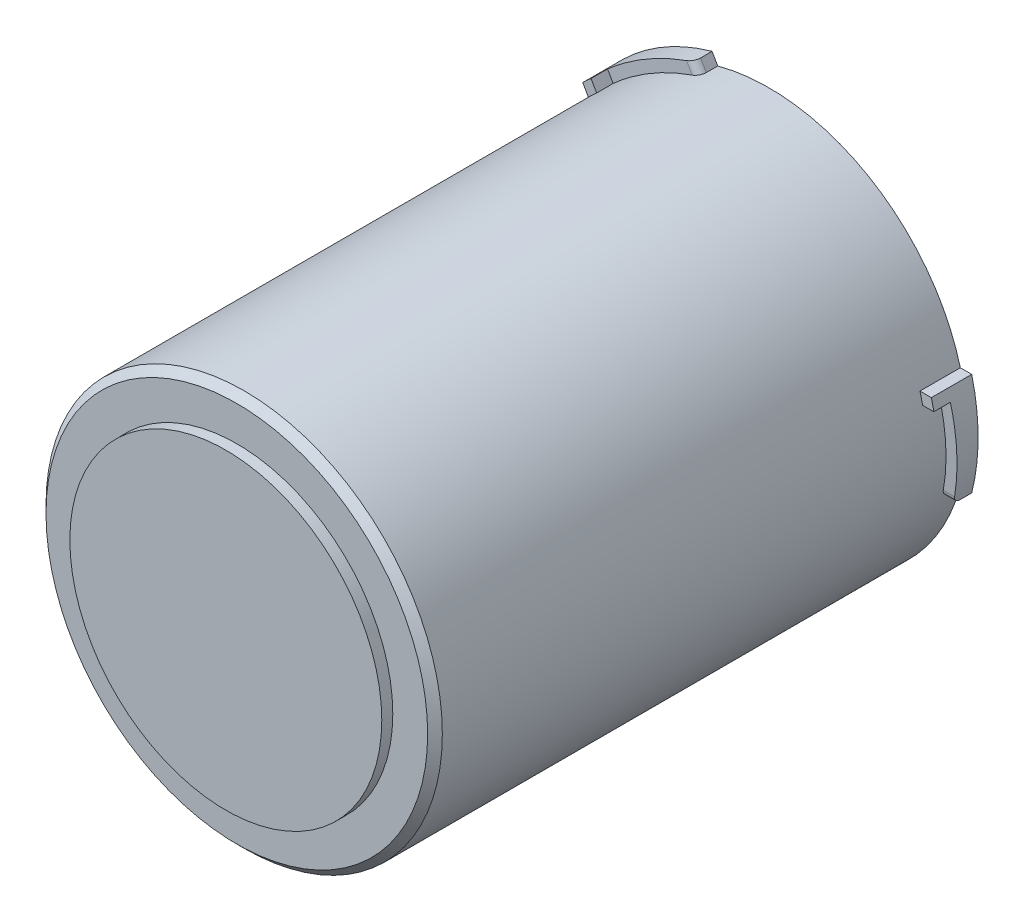
ISO-10303-21;
HEADER;
FILE_DESCRIPTION(('STEP AP214'),'2;1');
FILE_NAME('part.step','',(''),(''),'','','');
FILE_SCHEMA(('AUTOMOTIVE_DESIGN { 1 0 10303 214 1 1 1 1 }'));
ENDSEC;
DATA;
#1=APPLICATION_CONTEXT('core data for automotive mechanical design processes');
#2=APPLICATION_PROTOCOL_DEFINITION('international standard','automotive_design',2000,#1);
#3=PRODUCT_CONTEXT('',#1,'mechanical');
#4=PRODUCT('Part','Part','',(#3));
#5=PRODUCT_RELATED_PRODUCT_CATEGORY('part','',(#4));
#6=PRODUCT_DEFINITION_FORMATION('','',#4);
#7=PRODUCT_DEFINITION_CONTEXT('part definition',#1,'design');
#8=PRODUCT_DEFINITION('design','',#6,#7);
#9=PRODUCT_DEFINITION_SHAPE('','',#8);
#10=(LENGTH_UNIT() NAMED_UNIT(*) SI_UNIT(.MILLI.,.METRE.));
#11=(NAMED_UNIT(*) PLANE_ANGLE_UNIT() SI_UNIT($,.RADIAN.));
#12=(NAMED_UNIT(*) SI_UNIT($,.STERADIAN.) SOLID_ANGLE_UNIT());
#13=UNCERTAINTY_MEASURE_WITH_UNIT(LENGTH_MEASURE(1.E-05),#10,'distance_accuracy_value','');
#14=(GEOMETRIC_REPRESENTATION_CONTEXT(3) GLOBAL_UNCERTAINTY_ASSIGNED_CONTEXT((#13)) GLOBAL_UNIT_ASSIGNED_CONTEXT((#10,
#11,#12)) REPRESENTATION_CONTEXT('',''));
#15=CARTESIAN_POINT('',(0.,0.,0.));
#16=DIRECTION('',(0.,0.,1.));
#17=DIRECTION('',(1.,0.,0.));
#18=AXIS2_PLACEMENT_3D('',#15,#16,#17);
#19=CARTESIAN_POINT('',(-54.,0.,-145.));
#20=DIRECTION('',(0.,0.,-1.));
#21=DIRECTION('',(-1.,0.,0.));
#22=AXIS2_PLACEMENT_3D('',#19,#20,#21);
#23=PLANE('',#22);
#24=CARTESIAN_POINT('',(0.,0.,-145.));
#25=DIRECTION('',(0.,0.,-1.));
#26=DIRECTION('',(-1.,0.,0.));
#27=AXIS2_PLACEMENT_3D('',#24,#25,#26);
#28=CIRCLE('',#27,51.);
#29=CARTESIAN_POINT('',(-51.,0.,-145.));
#30=VERTEX_POINT('',#29);
#31=EDGE_CURVE('E296',#30,#30,#28,.T.);
#32=ORIENTED_EDGE('',*,*,#31,.F.);
#33=EDGE_LOOP('',(#32));
#34=FACE_BOUND('',#33,.T.);
#35=DIRECTION('',(-0.499999999999992,0.866025403784443,0.));
#36=VECTOR('',#35,1.);
#37=CARTESIAN_POINT('',(-35.6243556529818,33.7031939778689,-145.));
#38=LINE('',#37,#36);
#39=CARTESIAN_POINT('',(-38.2011652737924,38.1663591625452,-145.));
#40=VERTEX_POINT('',#39);
#41=CARTESIAN_POINT('',(-39.7513352200644,40.8513322698547,-145.));
#42=VERTEX_POINT('',#41);
#43=EDGE_CURVE('E201',#40,#42,#38,.T.);
#44=ORIENTED_EDGE('',*,*,#43,.T.);
#45=CARTESIAN_POINT('',(0.,0.,-145.));
#46=DIRECTION('',(0.,0.,-1.));
#47=DIRECTION('',(-1.,0.,0.));
#48=AXIS2_PLACEMENT_3D('',#45,#46,#47);
#49=CIRCLE('',#48,57.);
#50=CARTESIAN_POINT('',(-15.5026239141,54.8513322698545,-145.));
#51=VERTEX_POINT('',#50);
#52=EDGE_CURVE('E182',#42,#51,#49,.T.);
#53=ORIENTED_EDGE('',*,*,#52,.T.);
#54=DIRECTION('',(-0.499999999999992,0.866025403784443,0.));
#55=VECTOR('',#54,1.);
#56=CARTESIAN_POINT('',(-11.3756443470174,47.7031939778687,-145.));
#57=LINE('',#56,#55);
#58=CARTESIAN_POINT('',(-13.952453967828,52.166359162545,-145.));
#59=VERTEX_POINT('',#58);
#60=EDGE_CURVE('E212',#59,#51,#57,.T.);
#61=ORIENTED_EDGE('',*,*,#60,.F.);
#62=CARTESIAN_POINT('',(0.,0.,-145.));
#63=DIRECTION('',(0.,0.,-1.));
#64=DIRECTION('',(-1.,0.,0.));
#65=AXIS2_PLACEMENT_3D('',#62,#63,#64);
#66=CIRCLE('',#65,54.);
#67=CARTESIAN_POINT('',(52.1536192416212,14.,-145.));
#68=VERTEX_POINT('',#67);
#69=EDGE_CURVE('E299',#59,#68,#66,.T.);
#70=ORIENTED_EDGE('',*,*,#69,.T.);
#71=DIRECTION('',(1.,0.,0.));
#72=VECTOR('',#71,1.);
#73=CARTESIAN_POINT('',(47.,14.,-145.));
#74=LINE('',#73,#72);
#75=CARTESIAN_POINT('',(55.2539591341652,14.,-145.));
#76=VERTEX_POINT('',#75);
#77=EDGE_CURVE('E268',#68,#76,#74,.T.);
#78=ORIENTED_EDGE('',*,*,#77,.T.);
#79=CARTESIAN_POINT('',(55.2539591341652,-14.,-145.));
#80=VERTEX_POINT('',#79);
#81=EDGE_CURVE('E193',#76,#80,#49,.T.);
#82=ORIENTED_EDGE('',*,*,#81,.T.);
#83=DIRECTION('',(1.,0.,0.));
#84=VECTOR('',#83,1.);
#85=CARTESIAN_POINT('',(47.,-14.,-145.));
#86=LINE('',#85,#84);
#87=CARTESIAN_POINT('',(52.1536192416212,-14.,-145.));
#88=VERTEX_POINT('',#87);
#89=EDGE_CURVE('E272',#88,#80,#86,.T.);
#90=ORIENTED_EDGE('',*,*,#89,.F.);
#91=CARTESIAN_POINT('',(-13.9524539678287,-52.1663591625448,-145.));
#92=VERTEX_POINT('',#91);
#93=EDGE_CURVE('E300',#88,#92,#66,.T.);
#94=ORIENTED_EDGE('',*,*,#93,.T.);
#95=DIRECTION('',(-0.500000000000004,-0.866025403784436,0.));
#96=VECTOR('',#95,1.);
#97=CARTESIAN_POINT('',(-11.3756443470181,-47.7031939778686,-145.));
#98=LINE('',#97,#96);
#99=CARTESIAN_POINT('',(-15.5026239141007,-54.8513322698542,-145.));
#100=VERTEX_POINT('',#99);
#101=EDGE_CURVE('E239',#92,#100,#98,.T.);
#102=ORIENTED_EDGE('',*,*,#101,.T.);
#103=CARTESIAN_POINT('',(-39.7513352200649,-40.8513322698541,-145.));
#104=VERTEX_POINT('',#103);
#105=EDGE_CURVE('E195',#100,#104,#49,.T.);
#106=ORIENTED_EDGE('',*,*,#105,.T.);
#107=DIRECTION('',(-0.500000000000004,-0.866025403784436,0.));
#108=VECTOR('',#107,1.);
#109=CARTESIAN_POINT('',(-35.6243556529823,-33.7031939778685,-145.));
#110=LINE('',#109,#108);
#111=CARTESIAN_POINT('',(-38.2011652737929,-38.1663591625447,-145.));
#112=VERTEX_POINT('',#111);
#113=EDGE_CURVE('E243',#112,#104,#110,.T.);
#114=ORIENTED_EDGE('',*,*,#113,.F.);
#115=EDGE_CURVE('E210',#112,#40,#66,.T.);
#116=ORIENTED_EDGE('',*,*,#115,.T.);
#117=EDGE_LOOP('',(#44,#53,#61,#70,#78,#82,#90,#94,#102,#106,#114,#116));
#118=FACE_BOUND('',#117,.T.);
#119=ADVANCED_FACE('F39',(#34,#118),#23,.T.);
#120=CARTESIAN_POINT('',(47.,14.,-134.));
#121=DIRECTION('',(0.,1.,0.));
#122=DIRECTION('',(0.,0.,1.));
#123=AXIS2_PLACEMENT_3D('',#120,#121,#122);
#124=PLANE('',#123);
#125=DIRECTION('',(1.,0.,0.));
#126=VECTOR('',#125,1.);
#127=CARTESIAN_POINT('',(47.,14.,-134.));
#128=LINE('',#127,#126);
#129=CARTESIAN_POINT('',(52.1536192416212,14.,-134.));
#130=VERTEX_POINT('',#129);
#131=CARTESIAN_POINT('',(55.2539591341652,14.,-134.));
#132=VERTEX_POINT('',#131);
#133=EDGE_CURVE('E267',#130,#132,#128,.T.);
#134=ORIENTED_EDGE('',*,*,#133,.T.);
#135=DIRECTION('',(0.,0.,-1.));
#136=VECTOR('',#135,1.);
#137=CARTESIAN_POINT('',(55.2539591341652,14.,-130.));
#138=LINE('',#137,#136);
#139=EDGE_CURVE('E220',#132,#76,#138,.T.);
#140=ORIENTED_EDGE('',*,*,#139,.T.);
#141=ORIENTED_EDGE('',*,*,#77,.F.);
#142=DIRECTION('',(0.,0.,-1.));
#143=VECTOR('',#142,1.);
#144=CARTESIAN_POINT('',(52.1536192416212,14.,-2.99999999999999));
#145=LINE('',#144,#143);
#146=EDGE_CURVE('E293',#68,#130,#145,.F.);
#147=ORIENTED_EDGE('',*,*,#146,.T.);
#148=EDGE_LOOP('',(#134,#140,#141,#147));
#149=FACE_BOUND('',#148,.T.);
#150=ADVANCED_FACE('F414',(#149),#124,.T.);
#151=CARTESIAN_POINT('',(47.,-14.,-145.));
#152=DIRECTION('',(0.,-1.,0.));
#153=DIRECTION('',(0.,0.,-1.));
#154=AXIS2_PLACEMENT_3D('',#151,#152,#153);
#155=PLANE('',#154);
#156=ORIENTED_EDGE('',*,*,#89,.T.);
#157=DIRECTION('',(0.,0.,-1.));
#158=VECTOR('',#157,1.);
#159=CARTESIAN_POINT('',(55.2539591341652,-14.,-130.));
#160=LINE('',#159,#158);
#161=CARTESIAN_POINT('',(55.2539591341652,-14.,-141.883596765819));
#162=VERTEX_POINT('',#161);
#163=EDGE_CURVE('E392',#80,#162,#160,.F.);
#164=ORIENTED_EDGE('',*,*,#163,.T.);
#165=DIRECTION('',(1.,0.,0.));
#166=VECTOR('',#165,1.);
#167=CARTESIAN_POINT('',(47.,-14.,-141.883596765819));
#168=LINE('',#167,#166);
#169=CARTESIAN_POINT('',(52.1536192416212,-14.,-141.883596765819));
#170=VERTEX_POINT('',#169);
#171=EDGE_CURVE('E306',#162,#170,#168,.F.);
#172=ORIENTED_EDGE('',*,*,#171,.T.);
#173=DIRECTION('',(0.,0.,-1.));
#174=VECTOR('',#173,1.);
#175=CARTESIAN_POINT('',(52.1536192416212,-14.,-2.99999999999999));
#176=LINE('',#175,#174);
#177=EDGE_CURVE('E291',#170,#88,#176,.T.);
#178=ORIENTED_EDGE('',*,*,#177,.T.);
#179=EDGE_LOOP('',(#156,#164,#172,#178));
#180=FACE_BOUND('',#179,.T.);
#181=ADVANCED_FACE('F488',(#180),#155,.T.);
#182=CARTESIAN_POINT('',(47.,-14.,-140.));
#183=DIRECTION('',(0.,-0.0598922907279468,0.998204845465779));
#184=DIRECTION('',(0.,-0.998204845465779,-0.0598922907279468));
#185=AXIS2_PLACEMENT_3D('',#182,#183,#184);
#186=PLANE('',#185);
#187=DIRECTION('',(1.,0.,0.));
#188=VECTOR('',#187,1.);
#189=CARTESIAN_POINT('',(47.,-12.1197845814559,-139.887187074887));
#190=LINE('',#189,#188);
#191=CARTESIAN_POINT('',(52.6223414691812,-12.1197845814559,-139.887187074887));
#192=VERTEX_POINT('',#191);
#193=CARTESIAN_POINT('',(55.6965961410489,-12.1197845814559,-139.887187074887));
#194=VERTEX_POINT('',#193);
#195=EDGE_CURVE('E303',#192,#194,#190,.T.);
#196=ORIENTED_EDGE('',*,*,#195,.T.);
#197=CARTESIAN_POINT('',(0.,0.,-139.16));
#198=DIRECTION('',(0.,-0.0598922907279468,0.998204845465779));
#199=DIRECTION('',(0.,-0.998204845465779,-0.0598922907279468));
#200=AXIS2_PLACEMENT_3D('',#197,#198,#199);
#201=ELLIPSE('',#200,57.102507825839,57.);
#202=CARTESIAN_POINT('',(55.9285258164383,11.,-138.5));
#203=VERTEX_POINT('',#202);
#204=EDGE_CURVE('E55',#194,#203,#201,.T.);
#205=ORIENTED_EDGE('',*,*,#204,.T.);
#206=DIRECTION('',(1.,0.,0.));
#207=VECTOR('',#206,1.);
#208=CARTESIAN_POINT('',(47.,11.,-138.5));
#209=LINE('',#208,#207);
#210=CARTESIAN_POINT('',(52.8677595515452,10.9999999999999,-138.5));
#211=VERTEX_POINT('',#210);
#212=EDGE_CURVE('E275',#211,#203,#209,.T.);
#213=ORIENTED_EDGE('',*,*,#212,.F.);
#214=CARTESIAN_POINT('',(0.,0.,-139.16));
#215=DIRECTION('',(0.,-0.0598922907279468,0.998204845465779));
#216=DIRECTION('',(0.,-0.998204845465779,-0.0598922907279468));
#217=AXIS2_PLACEMENT_3D('',#214,#215,#216);
#218=ELLIPSE('',#217,54.0971126771106,54.);
#219=EDGE_CURVE('E288',#211,#192,#218,.F.);
#220=ORIENTED_EDGE('',*,*,#219,.T.);
#221=EDGE_LOOP('',(#196,#205,#213,#220));
#222=FACE_BOUND('',#221,.T.);
#223=ADVANCED_FACE('F506',(#222),#186,.T.);
#224=CARTESIAN_POINT('',(47.,11.,-138.5));
#225=DIRECTION('',(0.,-1.,0.));
#226=DIRECTION('',(0.,0.,-1.));
#227=AXIS2_PLACEMENT_3D('',#224,#225,#226);
#228=PLANE('',#227);
#229=ORIENTED_EDGE('',*,*,#212,.T.);
#230=DIRECTION('',(0.,0.,-1.));
#231=VECTOR('',#230,1.);
#232=CARTESIAN_POINT('',(55.9285258164383,11.,-130.));
#233=LINE('',#232,#231);
#234=CARTESIAN_POINT('',(55.9285258164383,11.,-134.));
#235=VERTEX_POINT('',#234);
#236=EDGE_CURVE('E396',#203,#235,#233,.F.);
#237=ORIENTED_EDGE('',*,*,#236,.T.);
#238=DIRECTION('',(1.,0.,0.));
#239=VECTOR('',#238,1.);
#240=CARTESIAN_POINT('',(47.,11.,-134.));
#241=LINE('',#240,#239);
#242=CARTESIAN_POINT('',(52.8677595515452,11.,-134.));
#243=VERTEX_POINT('',#242);
#244=EDGE_CURVE('E278',#243,#235,#241,.T.);
#245=ORIENTED_EDGE('',*,*,#244,.F.);
#246=DIRECTION('',(0.,0.,-1.));
#247=VECTOR('',#246,1.);
#248=CARTESIAN_POINT('',(52.8677595515452,10.9999999999999,-2.99999999999999));
#249=LINE('',#248,#247);
#250=EDGE_CURVE('E285',#243,#211,#249,.T.);
#251=ORIENTED_EDGE('',*,*,#250,.T.);
#252=EDGE_LOOP('',(#229,#237,#245,#251));
#253=FACE_BOUND('',#252,.T.);
#254=ADVANCED_FACE('F404',(#253),#228,.T.);
#255=CARTESIAN_POINT('',(47.,11.,-134.));
#256=DIRECTION('',(0.,0.,1.));
#257=DIRECTION('',(1.,0.,0.));
#258=AXIS2_PLACEMENT_3D('',#255,#256,#257);
#259=PLANE('',#258);
#260=ORIENTED_EDGE('',*,*,#244,.T.);
#261=CARTESIAN_POINT('',(0.,0.,-134.));
#262=DIRECTION('',(0.,0.,1.));
#263=DIRECTION('',(1.,0.,0.));
#264=AXIS2_PLACEMENT_3D('',#261,#262,#263);
#265=CIRCLE('',#264,57.);
#266=EDGE_CURVE('E399',#235,#132,#265,.T.);
#267=ORIENTED_EDGE('',*,*,#266,.T.);
#268=ORIENTED_EDGE('',*,*,#133,.F.);
#269=CARTESIAN_POINT('',(0.,0.,-134.));
#270=DIRECTION('',(0.,0.,1.));
#271=DIRECTION('',(1.,0.,0.));
#272=AXIS2_PLACEMENT_3D('',#269,#270,#271);
#273=CIRCLE('',#272,54.);
#274=EDGE_CURVE('E271',#130,#243,#273,.F.);
#275=ORIENTED_EDGE('',*,*,#274,.T.);
#276=EDGE_LOOP('',(#260,#267,#268,#275));
#277=FACE_BOUND('',#276,.T.);
#278=ADVANCED_FACE('F407',(#277),#259,.T.);
#279=CARTESIAN_POINT('',(47.,-12.,-141.883596765819));
#280=DIRECTION('',(1.,0.,0.));
#281=DIRECTION('',(0.,0.,-1.));
#282=AXIS2_PLACEMENT_3D('',#279,#280,#281);
#283=CYLINDRICAL_SURFACE('',#282,2.);
#284=ORIENTED_EDGE('',*,*,#171,.F.);
#285=CARTESIAN_POINT('',(55.2539591341652,-14.,-141.883596765819));
#286=CARTESIAN_POINT('',(55.2539585125054,-14.0000005367194,-141.828523752097));
#287=CARTESIAN_POINT('',(55.2545359383956,-13.9977237283669,-141.773477634569));
#288=CARTESIAN_POINT('',(55.256834841071,-13.9886466767112,-141.663790158488));
#289=CARTESIAN_POINT('',(55.258556183353,-13.9818469652169,-141.609148753112));
#290=CARTESIAN_POINT('',(55.2654066347746,-13.9547553891467,-141.446613532741));
#291=CARTESIAN_POINT('',(55.2722223012515,-13.9277707139644,-141.339826121369));
#292=CARTESIAN_POINT('',(55.2900482512312,-13.8568352806215,-141.13247070724));
#293=CARTESIAN_POINT('',(55.3010591486179,-13.8128820394553,-141.0319036172));
#294=CARTESIAN_POINT('',(55.3268019748571,-13.7094060836742,-140.839640585733));
#295=CARTESIAN_POINT('',(55.3415341361408,-13.6498823965163,-140.74794519893));
#296=CARTESIAN_POINT('',(55.3743582345525,-13.5161106300099,-140.574562123407));
#297=CARTESIAN_POINT('',(55.3924951314453,-13.4416644849191,-140.493035984245));
#298=CARTESIAN_POINT('',(55.4312966401882,-13.2807451622867,-140.343545714561));
#299=CARTESIAN_POINT('',(55.4519621934757,-13.1942675036721,-140.275586660097));
#300=CARTESIAN_POINT('',(55.4957013876148,-13.0090901553543,-140.153160374182));
#301=CARTESIAN_POINT('',(55.518826869443,-12.9101124025027,-140.099132804047));
#302=CARTESIAN_POINT('',(55.5661779443691,-12.7047603394677,-140.008527143711));
#303=CARTESIAN_POINT('',(55.5904027393309,-12.5983913666549,-139.971936608825));
#304=CARTESIAN_POINT('',(55.6284079350701,-12.4291640094491,-139.929179878513));
#305=CARTESIAN_POINT('',(55.6420827192817,-12.3678057292128,-139.91671276943));
#306=CARTESIAN_POINT('',(55.6693916711392,-12.2442983859839,-139.897592125891));
#307=CARTESIAN_POINT('',(55.6830258677354,-12.1821509274881,-139.890928268508));
#308=CARTESIAN_POINT('',(55.6965961410489,-12.1197845814559,-139.887187074887));
#309=B_SPLINE_CURVE_WITH_KNOTS('',3,(#285,#286,#287,#288,#289,#290,#291,#292,#293,#294,#295,
#296,#297,#298,#299,#300,#301,#302,#303,#304,#305,#306,#307,#308),.UNSPECIFIED.,.F.,.F.,(4,2,2,
2,2,2,2,2,2,2,2,4),(0.,0.165115829650282,0.330212248197019,0.659568276928968,0.988972518515699,
1.3183973398773,1.65252481489193,1.98677706870723,2.33055444574179,2.67408610256854,
2.86610985522351,3.05779133078798),.UNSPECIFIED.);
#310=EDGE_CURVE('E385',#162,#194,#309,.T.);
#311=ORIENTED_EDGE('',*,*,#310,.T.);
#312=ORIENTED_EDGE('',*,*,#195,.F.);
#313=CARTESIAN_POINT('',(52.1536192416212,-14.,-141.883596765819));
#314=CARTESIAN_POINT('',(52.1536185568167,-14.000000638517,-141.828662060855));
#315=CARTESIAN_POINT('',(52.1542272711735,-13.9977351396233,-141.773754247999));
#316=CARTESIAN_POINT('',(52.1566505453299,-13.9887038828323,-141.664343674894));
#317=CARTESIAN_POINT('',(52.158464953455,-13.9819386909891,-141.609840864568));
#318=CARTESIAN_POINT('',(52.1656848064175,-13.9549882075101,-141.447731525654));
#319=CARTESIAN_POINT('',(52.1728670286606,-13.9281476143837,-141.341230667811));
#320=CARTESIAN_POINT('',(52.1916461762234,-13.8576110310764,-141.134439932355));
#321=CARTESIAN_POINT('',(52.2032435734467,-13.813913239154,-141.034150719988));
#322=CARTESIAN_POINT('',(52.2303500158355,-13.7110668756349,-140.842403980467));
#323=CARTESIAN_POINT('',(52.245859428544,-13.6519168522463,-140.750947284266));
#324=CARTESIAN_POINT('',(52.2804344282289,-13.5189111311201,-140.577834270253));
#325=CARTESIAN_POINT('',(52.2995526191321,-13.4448366435394,-140.496356823663));
#326=CARTESIAN_POINT('',(52.3404491882954,-13.2847354020005,-140.346894771056));
#327=CARTESIAN_POINT('',(52.3622285676468,-13.1987041484386,-140.278915268124));
#328=CARTESIAN_POINT('',(52.40839878766,-13.0141868009322,-140.156142920303));
#329=CARTESIAN_POINT('',(52.4328506404641,-12.9153916877053,-140.101838038407));
#330=CARTESIAN_POINT('',(52.4829233339157,-12.710383840538,-140.010652502082));
#331=CARTESIAN_POINT('',(52.5085433737358,-12.6041761623991,-139.973760102094));
#332=CARTESIAN_POINT('',(52.5489871949959,-12.4341455626784,-139.930247501891));
#333=CARTESIAN_POINT('',(52.5636978622072,-12.371814966283,-139.917434127239));
#334=CARTESIAN_POINT('',(52.5930762727059,-12.2463257733772,-139.897810259443));
#335=CARTESIAN_POINT('',(52.6077440457752,-12.1831688496745,-139.890989113374));
#336=CARTESIAN_POINT('',(52.6223414691812,-12.1197845814559,-139.887187074887));
#337=B_SPLINE_CURVE_WITH_KNOTS('',3,(#313,#314,#315,#316,#317,#318,#319,#320,#321,#322,#323,
#324,#325,#326,#327,#328,#329,#330,#331,#332,#333,#334,#335,#336),.UNSPECIFIED.,.F.,.F.,(4,2,2,
2,2,2,2,2,2,2,2,4),(0.,0.164700948774083,0.329381182352863,0.65787279650389,0.986399530428337,
1.31495714171092,1.64873685506211,1.98264251916462,2.32716416508593,2.67145308123225,
2.8671373137039,3.0624729525344),.UNSPECIFIED.);
#338=EDGE_CURVE('E308',#170,#192,#337,.T.);
#339=ORIENTED_EDGE('',*,*,#338,.F.);
#340=EDGE_LOOP('',(#284,#311,#312,#339));
#341=FACE_BOUND('',#340,.T.);
#342=ADVANCED_FACE('F318',(#341),#283,.T.);
#343=CARTESIAN_POINT('',(-11.3756443470181,-47.7031939778686,-134.));
#344=DIRECTION('',(0.866025403784436,-0.500000000000004,0.));
#345=DIRECTION('',(0.500000000000004,0.866025403784436,0.));
#346=AXIS2_PLACEMENT_3D('',#343,#344,#345);
#347=PLANE('',#346);
#348=DIRECTION('',(-0.500000000000004,-0.866025403784436,0.));
#349=VECTOR('',#348,1.);
#350=CARTESIAN_POINT('',(-11.3756443470181,-47.7031939778686,-134.));
#351=LINE('',#350,#349);
#352=CARTESIAN_POINT('',(-13.9524539678287,-52.1663591625448,-134.));
#353=VERTEX_POINT('',#352);
#354=CARTESIAN_POINT('',(-15.5026239141007,-54.8513322698542,-134.));
#355=VERTEX_POINT('',#354);
#356=EDGE_CURVE('E238',#353,#355,#351,.T.);
#357=ORIENTED_EDGE('',*,*,#356,.T.);
#358=DIRECTION('',(0.,0.,-1.));
#359=VECTOR('',#358,1.);
#360=CARTESIAN_POINT('',(-15.5026239141007,-54.8513322698542,-130.));
#361=LINE('',#360,#359);
#362=EDGE_CURVE('E393',#355,#100,#361,.T.);
#363=ORIENTED_EDGE('',*,*,#362,.T.);
#364=ORIENTED_EDGE('',*,*,#101,.F.);
#365=DIRECTION('',(0.,0.,-1.));
#366=VECTOR('',#365,1.);
#367=CARTESIAN_POINT('',(-13.9524539678287,-52.1663591625448,-3.));
#368=LINE('',#367,#366);
#369=EDGE_CURVE('E264',#92,#353,#368,.F.);
#370=ORIENTED_EDGE('',*,*,#369,.T.);
#371=EDGE_LOOP('',(#357,#363,#364,#370));
#372=FACE_BOUND('',#371,.T.);
#373=ADVANCED_FACE('F467',(#372),#347,.T.);
#374=CARTESIAN_POINT('',(-35.6243556529823,-33.7031939778685,-145.));
#375=DIRECTION('',(-0.866025403784436,0.500000000000004,0.));
#376=DIRECTION('',(-0.500000000000004,-0.866025403784436,0.));
#377=AXIS2_PLACEMENT_3D('',#374,#375,#376);
#378=PLANE('',#377);
#379=ORIENTED_EDGE('',*,*,#113,.T.);
#380=DIRECTION('',(0.,0.,-1.));
#381=VECTOR('',#380,1.);
#382=CARTESIAN_POINT('',(-39.7513352200649,-40.8513322698541,-130.));
#383=LINE('',#382,#381);
#384=CARTESIAN_POINT('',(-39.7513352200649,-40.8513322698541,-141.883596765819));
#385=VERTEX_POINT('',#384);
#386=EDGE_CURVE('E361',#104,#385,#383,.F.);
#387=ORIENTED_EDGE('',*,*,#386,.T.);
#388=DIRECTION('',(-0.500000000000004,-0.866025403784436,0.));
#389=VECTOR('',#388,1.);
#390=CARTESIAN_POINT('',(-35.6243556529823,-33.7031939778685,-141.883596765819));
#391=LINE('',#390,#389);
#392=CARTESIAN_POINT('',(-38.2011652737929,-38.1663591625447,-141.883596765819));
#393=VERTEX_POINT('',#392);
#394=EDGE_CURVE('E341',#385,#393,#391,.F.);
#395=ORIENTED_EDGE('',*,*,#394,.T.);
#396=DIRECTION('',(0.,0.,-1.));
#397=VECTOR('',#396,1.);
#398=CARTESIAN_POINT('',(-38.2011652737929,-38.1663591625447,-3.));
#399=LINE('',#398,#397);
#400=EDGE_CURVE('E262',#393,#112,#399,.T.);
#401=ORIENTED_EDGE('',*,*,#400,.T.);
#402=EDGE_LOOP('',(#379,#387,#395,#401));
#403=FACE_BOUND('',#402,.T.);
#404=ADVANCED_FACE('F449',(#403),#378,.T.);
#405=CARTESIAN_POINT('',(-35.6243556529823,-33.7031939778685,-140.));
#406=DIRECTION('',(-0.0518682452612451,0.0299461453639736,0.998204845465779));
#407=DIRECTION('',(0.998652727613559,0.,0.0518915179003178));
#408=AXIS2_PLACEMENT_3D('',#405,#406,#407);
#409=PLANE('',#408);
#410=DIRECTION('',(-0.500000000000004,-0.866025403784436,0.));
#411=VECTOR('',#410,1.);
#412=CARTESIAN_POINT('',(-33.9960413359359,-34.6433016871405,-139.887187074887));
#413=LINE('',#412,#411);
#414=CARTESIAN_POINT('',(-36.8072120705265,-39.5123922282021,-139.887187074887));
#415=VERTEX_POINT('',#414);
#416=CARTESIAN_POINT('',(-38.3443394064604,-42.1747748717426,-139.887187074887));
#417=VERTEX_POINT('',#416);
#418=EDGE_CURVE('E316',#415,#417,#413,.T.);
#419=ORIENTED_EDGE('',*,*,#418,.T.);
#420=CARTESIAN_POINT('',(0.,0.,-139.16));
#421=DIRECTION('',(-0.0518682452612451,0.0299461453639736,0.998204845465779));
#422=DIRECTION('',(-0.864470754354082,0.499102422732892,-0.0598922907279468));
#423=AXIS2_PLACEMENT_3D('',#420,#421,#422);
#424=ELLIPSE('',#423,57.102507825839,57.);
#425=CARTESIAN_POINT('',(-18.4379834665905,-53.9355241532492,-138.5));
#426=VERTEX_POINT('',#425);
#427=EDGE_CURVE('E63',#417,#426,#424,.T.);
#428=ORIENTED_EDGE('',*,*,#427,.T.);
#429=DIRECTION('',(-0.500000000000004,-0.866025403784436,0.));
#430=VECTOR('',#429,1.);
#431=CARTESIAN_POINT('',(-13.9737205583714,-46.2031939778686,-138.5));
#432=LINE('',#431,#430);
#433=CARTESIAN_POINT('',(-16.9076003341441,-51.2848228128055,-138.5));
#434=VERTEX_POINT('',#433);
#435=EDGE_CURVE('E246',#434,#426,#432,.T.);
#436=ORIENTED_EDGE('',*,*,#435,.F.);
#437=CARTESIAN_POINT('',(0.,0.,-139.16));
#438=DIRECTION('',(-0.0518682452612451,0.0299461453639736,0.998204845465779));
#439=DIRECTION('',(-0.864470754354082,0.499102422732892,-0.0598922907279468));
#440=AXIS2_PLACEMENT_3D('',#437,#438,#439);
#441=ELLIPSE('',#440,54.0971126771106,54.);
#442=EDGE_CURVE('E259',#434,#415,#441,.F.);
#443=ORIENTED_EDGE('',*,*,#442,.T.);
#444=EDGE_LOOP('',(#419,#428,#436,#443));
#445=FACE_BOUND('',#444,.T.);
#446=ADVANCED_FACE('F454',(#445),#409,.T.);
#447=CARTESIAN_POINT('',(-13.9737205583714,-46.2031939778686,-138.5));
#448=DIRECTION('',(-0.866025403784436,0.500000000000004,0.));
#449=DIRECTION('',(-0.500000000000004,-0.866025403784436,0.));
#450=AXIS2_PLACEMENT_3D('',#447,#448,#449);
#451=PLANE('',#450);
#452=ORIENTED_EDGE('',*,*,#435,.T.);
#453=DIRECTION('',(0.,0.,-1.));
#454=VECTOR('',#453,1.);
#455=CARTESIAN_POINT('',(-18.4379834665905,-53.9355241532492,-130.));
#456=LINE('',#455,#454);
#457=CARTESIAN_POINT('',(-18.4379834665905,-53.9355241532492,-134.));
#458=VERTEX_POINT('',#457);
#459=EDGE_CURVE('E461',#426,#458,#456,.F.);
#460=ORIENTED_EDGE('',*,*,#459,.T.);
#461=DIRECTION('',(-0.500000000000004,-0.866025403784436,0.));
#462=VECTOR('',#461,1.);
#463=CARTESIAN_POINT('',(-13.9737205583714,-46.2031939778686,-134.));
#464=LINE('',#463,#462);
#465=CARTESIAN_POINT('',(-16.907600334144,-51.2848228128055,-134.));
#466=VERTEX_POINT('',#465);
#467=EDGE_CURVE('E249',#466,#458,#464,.T.);
#468=ORIENTED_EDGE('',*,*,#467,.F.);
#469=DIRECTION('',(0.,0.,-1.));
#470=VECTOR('',#469,1.);
#471=CARTESIAN_POINT('',(-16.9076003341441,-51.2848228128055,-2.99999999999999));
#472=LINE('',#471,#470);
#473=EDGE_CURVE('E256',#466,#434,#472,.T.);
#474=ORIENTED_EDGE('',*,*,#473,.T.);
#475=EDGE_LOOP('',(#452,#460,#468,#474));
#476=FACE_BOUND('',#475,.T.);
#477=ADVANCED_FACE('F474',(#476),#451,.T.);
#478=CARTESIAN_POINT('',(-13.9737205583714,-46.2031939778686,-134.));
#479=DIRECTION('',(0.,0.,1.));
#480=DIRECTION('',(1.,0.,0.));
#481=AXIS2_PLACEMENT_3D('',#478,#479,#480);
#482=PLANE('',#481);
#483=ORIENTED_EDGE('',*,*,#467,.T.);
#484=CARTESIAN_POINT('',(0.,0.,-134.));
#485=DIRECTION('',(0.,0.,1.));
#486=DIRECTION('',(1.,0.,0.));
#487=AXIS2_PLACEMENT_3D('',#484,#485,#486);
#488=CIRCLE('',#487,57.);
#489=EDGE_CURVE('E204',#458,#355,#488,.T.);
#490=ORIENTED_EDGE('',*,*,#489,.T.);
#491=ORIENTED_EDGE('',*,*,#356,.F.);
#492=CARTESIAN_POINT('',(0.,0.,-134.));
#493=DIRECTION('',(0.,0.,1.));
#494=DIRECTION('',(1.,0.,0.));
#495=AXIS2_PLACEMENT_3D('',#492,#493,#494);
#496=CIRCLE('',#495,54.);
#497=EDGE_CURVE('E242',#353,#466,#496,.F.);
#498=ORIENTED_EDGE('',*,*,#497,.T.);
#499=EDGE_LOOP('',(#483,#490,#491,#498));
#500=FACE_BOUND('',#499,.T.);
#501=ADVANCED_FACE('F473',(#500),#482,.T.);
#502=CARTESIAN_POINT('',(-35.6243556529818,33.7031939778689,-134.));
#503=DIRECTION('',(-0.866025403784443,-0.499999999999992,0.));
#504=DIRECTION('',(0.499999999999992,-0.866025403784443,0.));
#505=AXIS2_PLACEMENT_3D('',#502,#503,#504);
#506=PLANE('',#505);
#507=DIRECTION('',(-0.499999999999992,0.866025403784443,0.));
#508=VECTOR('',#507,1.);
#509=CARTESIAN_POINT('',(-35.6243556529818,33.7031939778689,-134.));
#510=LINE('',#509,#508);
#511=CARTESIAN_POINT('',(-38.2011652737924,38.1663591625452,-134.));
#512=VERTEX_POINT('',#511);
#513=CARTESIAN_POINT('',(-39.7513352200644,40.8513322698547,-134.));
#514=VERTEX_POINT('',#513);
#515=EDGE_CURVE('E203',#512,#514,#510,.T.);
#516=ORIENTED_EDGE('',*,*,#515,.T.);
#517=DIRECTION('',(0.,0.,-1.));
#518=VECTOR('',#517,1.);
#519=CARTESIAN_POINT('',(-39.7513352200644,40.8513322698547,-130.));
#520=LINE('',#519,#518);
#521=EDGE_CURVE('E185',#514,#42,#520,.T.);
#522=ORIENTED_EDGE('',*,*,#521,.T.);
#523=ORIENTED_EDGE('',*,*,#43,.F.);
#524=DIRECTION('',(0.,0.,-1.));
#525=VECTOR('',#524,1.);
#526=CARTESIAN_POINT('',(-38.2011652737924,38.1663591625452,-3.));
#527=LINE('',#526,#525);
#528=EDGE_CURVE('E236',#40,#512,#527,.F.);
#529=ORIENTED_EDGE('',*,*,#528,.T.);
#530=EDGE_LOOP('',(#516,#522,#523,#529));
#531=FACE_BOUND('',#530,.T.);
#532=ADVANCED_FACE('F199',(#531),#506,.T.);
#533=CARTESIAN_POINT('',(-11.3756443470174,47.7031939778687,-145.));
#534=DIRECTION('',(0.866025403784443,0.499999999999992,0.));
#535=DIRECTION('',(-0.499999999999992,0.866025403784443,0.));
#536=AXIS2_PLACEMENT_3D('',#533,#534,#535);
#537=PLANE('',#536);
#538=ORIENTED_EDGE('',*,*,#60,.T.);
#539=DIRECTION('',(0.,0.,-1.));
#540=VECTOR('',#539,1.);
#541=CARTESIAN_POINT('',(-15.5026239141,54.8513322698544,-130.));
#542=LINE('',#541,#540);
#543=CARTESIAN_POINT('',(-15.5026239141,54.8513322698545,-141.883596765819));
#544=VERTEX_POINT('',#543);
#545=EDGE_CURVE('E188',#51,#544,#542,.F.);
#546=ORIENTED_EDGE('',*,*,#545,.T.);
#547=DIRECTION('',(-0.499999999999992,0.866025403784443,0.));
#548=VECTOR('',#547,1.);
#549=CARTESIAN_POINT('',(-11.3756443470174,47.7031939778687,-141.883596765819));
#550=LINE('',#549,#548);
#551=CARTESIAN_POINT('',(-13.952453967828,52.166359162545,-141.883596765819));
#552=VERTEX_POINT('',#551);
#553=EDGE_CURVE('E426',#544,#552,#550,.F.);
#554=ORIENTED_EDGE('',*,*,#553,.T.);
#555=DIRECTION('',(0.,0.,-1.));
#556=VECTOR('',#555,1.);
#557=CARTESIAN_POINT('',(-13.952453967828,52.166359162545,-3.));
#558=LINE('',#557,#556);
#559=EDGE_CURVE('E234',#552,#59,#558,.T.);
#560=ORIENTED_EDGE('',*,*,#559,.T.);
#561=EDGE_LOOP('',(#538,#546,#554,#560));
#562=FACE_BOUND('',#561,.T.);
#563=ADVANCED_FACE('F373',(#562),#537,.T.);
#564=CARTESIAN_POINT('',(-11.3756443470174,47.7031939778687,-140.));
#565=DIRECTION('',(0.0518682452612452,0.029946145363973,0.998204845465779));
#566=DIRECTION('',(0.998652727613559,0.,-0.051891517900318));
#567=AXIS2_PLACEMENT_3D('',#564,#565,#566);
#568=PLANE('',#567);
#569=DIRECTION('',(-0.499999999999992,0.866025403784443,0.));
#570=VECTOR('',#569,1.);
#571=CARTESIAN_POINT('',(-13.0039586640638,46.7630862685967,-139.887187074887));
#572=LINE('',#571,#570);
#573=CARTESIAN_POINT('',(-15.8151293986544,51.6321768096583,-139.887187074887));
#574=VERTEX_POINT('',#573);
#575=CARTESIAN_POINT('',(-17.3522567345882,54.2945594531988,-139.887187074887));
#576=VERTEX_POINT('',#575);
#577=EDGE_CURVE('E340',#574,#576,#572,.T.);
#578=ORIENTED_EDGE('',*,*,#577,.T.);
#579=CARTESIAN_POINT('',(0.,0.,-139.16));
#580=DIRECTION('',(0.0518682452612452,0.029946145363973,0.998204845465779));
#581=DIRECTION('',(0.864470754354088,0.499102422732882,-0.0598922907279467));
#582=AXIS2_PLACEMENT_3D('',#579,#580,#581);
#583=ELLIPSE('',#582,57.102507825839,57.);
#584=CARTESIAN_POINT('',(-37.4905423498475,42.9355241532497,-138.5));
#585=VERTEX_POINT('',#584);
#586=EDGE_CURVE('E205',#576,#585,#583,.T.);
#587=ORIENTED_EDGE('',*,*,#586,.T.);
#588=DIRECTION('',(-0.499999999999992,0.866025403784443,0.));
#589=VECTOR('',#588,1.);
#590=CARTESIAN_POINT('',(-33.0262794416285,35.2031939778689,-138.5));
#591=LINE('',#590,#589);
#592=CARTESIAN_POINT('',(-35.960159217401,40.2848228128059,-138.5));
#593=VERTEX_POINT('',#592);
#594=EDGE_CURVE('E217',#593,#585,#591,.T.);
#595=ORIENTED_EDGE('',*,*,#594,.F.);
#596=CARTESIAN_POINT('',(0.,0.,-139.16));
#597=DIRECTION('',(0.0518682452612452,0.029946145363973,0.998204845465779));
#598=DIRECTION('',(0.864470754354088,0.499102422732882,-0.0598922907279467));
#599=AXIS2_PLACEMENT_3D('',#596,#597,#598);
#600=ELLIPSE('',#599,54.0971126771106,54.);
#601=EDGE_CURVE('E231',#593,#574,#600,.F.);
#602=ORIENTED_EDGE('',*,*,#601,.T.);
#603=EDGE_LOOP('',(#578,#587,#595,#602));
#604=FACE_BOUND('',#603,.T.);
#605=ADVANCED_FACE('F435',(#604),#568,.T.);
#606=CARTESIAN_POINT('',(-33.0262794416285,35.2031939778689,-138.5));
#607=DIRECTION('',(0.866025403784443,0.499999999999992,0.));
#608=DIRECTION('',(-0.499999999999992,0.866025403784443,0.));
#609=AXIS2_PLACEMENT_3D('',#606,#607,#608);
#610=PLANE('',#609);
#611=ORIENTED_EDGE('',*,*,#594,.T.);
#612=DIRECTION('',(0.,0.,-1.));
#613=VECTOR('',#612,1.);
#614=CARTESIAN_POINT('',(-37.4905423498475,42.9355241532497,-130.));
#615=LINE('',#614,#613);
#616=CARTESIAN_POINT('',(-37.4905423498475,42.9355241532497,-134.));
#617=VERTEX_POINT('',#616);
#618=EDGE_CURVE('E441',#585,#617,#615,.F.);
#619=ORIENTED_EDGE('',*,*,#618,.T.);
#620=DIRECTION('',(-0.499999999999992,0.866025403784443,0.));
#621=VECTOR('',#620,1.);
#622=CARTESIAN_POINT('',(-33.0262794416285,35.2031939778689,-134.));
#623=LINE('',#622,#621);
#624=CARTESIAN_POINT('',(-35.9601592174011,40.2848228128059,-134.));
#625=VERTEX_POINT('',#624);
#626=EDGE_CURVE('E225',#625,#617,#623,.T.);
#627=ORIENTED_EDGE('',*,*,#626,.F.);
#628=DIRECTION('',(0.,0.,-1.));
#629=VECTOR('',#628,1.);
#630=CARTESIAN_POINT('',(-35.960159217401,40.2848228128059,-2.99999999999999));
#631=LINE('',#630,#629);
#632=EDGE_CURVE('E215',#625,#593,#631,.T.);
#633=ORIENTED_EDGE('',*,*,#632,.T.);
#634=EDGE_LOOP('',(#611,#619,#627,#633));
#635=FACE_BOUND('',#634,.T.);
#636=ADVANCED_FACE('F439',(#635),#610,.T.);
#637=CARTESIAN_POINT('',(-33.0262794416285,35.2031939778689,-134.));
#638=DIRECTION('',(0.,0.,1.));
#639=DIRECTION('',(1.,0.,0.));
#640=AXIS2_PLACEMENT_3D('',#637,#638,#639);
#641=PLANE('',#640);
#642=ORIENTED_EDGE('',*,*,#626,.T.);
#643=CARTESIAN_POINT('',(0.,0.,-134.));
#644=DIRECTION('',(0.,0.,1.));
#645=DIRECTION('',(1.,0.,0.));
#646=AXIS2_PLACEMENT_3D('',#643,#644,#645);
#647=CIRCLE('',#646,57.);
#648=EDGE_CURVE('E443',#617,#514,#647,.T.);
#649=ORIENTED_EDGE('',*,*,#648,.T.);
#650=ORIENTED_EDGE('',*,*,#515,.F.);
#651=CARTESIAN_POINT('',(0.,0.,-134.));
#652=DIRECTION('',(0.,0.,1.));
#653=DIRECTION('',(1.,0.,0.));
#654=AXIS2_PLACEMENT_3D('',#651,#652,#653);
#655=CIRCLE('',#654,54.);
#656=EDGE_CURVE('E211',#512,#625,#655,.F.);
#657=ORIENTED_EDGE('',*,*,#656,.T.);
#658=EDGE_LOOP('',(#642,#649,#650,#657));
#659=FACE_BOUND('',#658,.T.);
#660=ADVANCED_FACE('F348',(#659),#641,.T.);
#661=CARTESIAN_POINT('',(-33.8923048454134,-34.7031939778685,-141.883596765819));
#662=DIRECTION('',(-0.500000000000004,-0.866025403784436,0.));
#663=DIRECTION('',(0.866025403784436,-0.500000000000004,0.));
#664=AXIS2_PLACEMENT_3D('',#661,#662,#663);
#665=CYLINDRICAL_SURFACE('',#664,2.);
#666=ORIENTED_EDGE('',*,*,#394,.F.);
#667=CARTESIAN_POINT('',(-39.7513352200649,-40.8513322698541,-141.883596765819));
#668=CARTESIAN_POINT('',(-39.7513353740477,-40.8513314631212,-141.828523752097));
#669=CARTESIAN_POINT('',(-39.7496523131199,-40.8529699327872,-141.773477634569));
#670=CARTESIAN_POINT('',(-39.7429408071323,-40.8594993667327,-141.663790158488));
#671=CARTESIAN_POINT('',(-39.7379127553809,-40.8643899486247,-141.609148753112));
#672=CARTESIAN_POINT('',(-39.7178759879863,-40.8838684016183,-141.446613532741));
#673=CARTESIAN_POINT('',(-39.697914407004,-40.9032632795222,-141.339826121369));
#674=CARTESIAN_POINT('',(-39.6453954946904,-40.9541687217227,-141.13247070724));
#675=CARTESIAN_POINT('',(-39.6128363199552,-40.9856810591611,-141.0319036172));
#676=CARTESIAN_POINT('',(-39.5360949266875,-41.05971297854,-140.839640585733));
#677=CARTESIAN_POINT('',(-39.4919119821237,-41.1022332480433,-140.74794519893));
#678=CARTESIAN_POINT('',(-39.3924742832259,-41.1975456343773,-140.574562123407));
#679=CARTESIAN_POINT('',(-39.3370704788098,-41.2504757203778,-140.493035984245));
#680=CARTESIAN_POINT('',(-39.2171110118218,-41.3645384739705,-140.343545714561));
#681=CARTESIAN_POINT('',(-39.1525519392455,-41.425674197408,-140.275586660097));
#682=CARTESIAN_POINT('',(-39.0140532484664,-41.5561421248324,-140.153160374182));
#683=CARTESIAN_POINT('',(-38.9398987410016,-41.6256582559962,-140.099132804047));
#684=CARTESIAN_POINT('',(-38.7857341751568,-41.7693415212962,-140.008527143711));
#685=CARTESIAN_POINT('',(-38.7057283400074,-41.843505295541,-139.971936608825));
#686=CARTESIAN_POINT('',(-38.5781757475214,-41.9610324391298,-139.929179878513));
#687=CARTESIAN_POINT('',(-38.53187531021,-42.0035542897665,-139.91671276943));
#688=CARTESIAN_POINT('',(-38.4385692893486,-42.0889582074403,-139.897592125891));
#689=CARTESIAN_POINT('',(-38.3915651098087,-42.1318394973006,-139.890928268508));
#690=CARTESIAN_POINT('',(-38.3443394064604,-42.1747748717426,-139.887187074887));
#691=B_SPLINE_CURVE_WITH_KNOTS('',3,(#667,#668,#669,#670,#671,#672,#673,#674,#675,#676,#677,
#678,#679,#680,#681,#682,#683,#684,#685,#686,#687,#688,#689,#690),.UNSPECIFIED.,.F.,.F.,(4,2,2,
2,2,2,2,2,2,2,2,4),(0.,0.165115829650282,0.330212248197019,0.659568276928968,0.988972518515697,
1.3183973398773,1.65252481489193,1.98677706870723,2.33055444574179,2.67408610256854,
2.86610985522352,3.05779133078798),.UNSPECIFIED.);
#692=EDGE_CURVE('E353',#385,#417,#691,.T.);
#693=ORIENTED_EDGE('',*,*,#692,.T.);
#694=ORIENTED_EDGE('',*,*,#418,.F.);
#695=CARTESIAN_POINT('',(-38.2011652737929,-38.1663591625447,-141.883596765819));
#696=CARTESIAN_POINT('',(-38.2011654843626,-38.1663582502281,-141.828662060855));
#697=CARTESIAN_POINT('',(-38.1995078619468,-38.1680181617716,-141.773754247999));
#698=CARTESIAN_POINT('',(-38.1928982012159,-38.1746324071468,-141.664343674894));
#699=CARTESIAN_POINT('',(-38.1879465772808,-38.1795863265976,-141.609840864568));
#700=CARTESIAN_POINT('',(-38.1682167004249,-38.1993141444142,-141.447731525654));
#701=CARTESIAN_POINT('',(-38.1485631760464,-38.2189544278956,-141.341230667811));
#702=CARTESIAN_POINT('',(-38.0968662767875,-38.2704859384,-141.134439932355));
#703=CARTESIAN_POINT('',(-38.0648215775051,-38.3023784749744,-141.034150719988));
#704=CARTESIAN_POINT('',(-37.9893072352051,-38.3772765244489,-140.842403980467));
#705=CARTESIAN_POINT('',(-37.9458365186704,-38.4202830815465,-140.750947284266));
#706=CARTESIAN_POINT('',(-37.8479376851689,-38.5167287701726,-140.577834270253));
#707=CARTESIAN_POINT('',(-37.7933463926033,-38.5703228529595,-140.496356823663));
#708=CARTESIAN_POINT('',(-37.6751429348347,-38.685790941552,-140.346894771056));
#709=CARTESIAN_POINT('',(-37.6115273734064,-38.7476680641299,-140.278915268124));
#710=CARTESIAN_POINT('',(-37.4748157730335,-38.8799113213129,-140.156142920303));
#711=CARTESIAN_POINT('',(-37.4014826216113,-38.9504848036242,-140.101838038407));
#712=CARTESIAN_POINT('',(-37.2489769647152,-39.0963529517729,-140.010652502082));
#713=CARTESIAN_POINT('',(-37.1698084372799,-39.1716443961726,-139.973760102094));
#714=CARTESIAN_POINT('',(-37.0427795291311,-39.2916850726702,-139.930247501891));
#715=CARTESIAN_POINT('',(-36.9961549828254,-39.3355901823795,-139.917434127239));
#716=CARTESIAN_POINT('',(-36.9021673591179,-39.4237772286471,-139.897810259443));
#717=CARTESIAN_POINT('',(-36.8548057453011,-39.4680583545935,-139.890989113374));
#718=CARTESIAN_POINT('',(-36.8072120705265,-39.5123922282021,-139.887187074887));
#719=B_SPLINE_CURVE_WITH_KNOTS('',3,(#695,#696,#697,#698,#699,#700,#701,#702,#703,#704,#705,
#706,#707,#708,#709,#710,#711,#712,#713,#714,#715,#716,#717,#718),.UNSPECIFIED.,.F.,.F.,(4,2,2,
2,2,2,2,2,2,2,2,4),(0.,0.164700948774083,0.329381182352863,0.657872796503891,0.986399530428364,
1.31495714171092,1.64873685506212,1.98264251916463,2.32716416508593,2.67145308123226,
2.86713731370389,3.0624729525344),.UNSPECIFIED.);
#720=EDGE_CURVE('E334',#393,#415,#719,.T.);
#721=ORIENTED_EDGE('',*,*,#720,.F.);
#722=EDGE_LOOP('',(#666,#693,#694,#721));
#723=FACE_BOUND('',#722,.T.);
#724=ADVANCED_FACE('F343',(#723),#665,.T.);
#725=CARTESIAN_POINT('',(-13.1076951545863,46.7031939778687,-141.883596765819));
#726=DIRECTION('',(-0.499999999999992,0.866025403784443,0.));
#727=DIRECTION('',(-0.866025403784443,-0.499999999999992,0.));
#728=AXIS2_PLACEMENT_3D('',#725,#726,#727);
#729=CYLINDRICAL_SURFACE('',#728,2.);
#730=ORIENTED_EDGE('',*,*,#553,.F.);
#731=CARTESIAN_POINT('',(-15.5026239141,54.8513322698545,-141.883596765819));
#732=CARTESIAN_POINT('',(-15.5026231384574,54.8513319998409,-141.828523752097));
#733=CARTESIAN_POINT('',(-15.5048836252753,54.8506936611544,-141.773477634569));
#734=CARTESIAN_POINT('',(-15.5138940339383,54.8481460434443,-141.663790158488));
#735=CARTESIAN_POINT('',(-15.5206434279717,54.8462369138419,-141.609148753112));
#736=CARTESIAN_POINT('',(-15.5475306467879,54.8386237907654,-141.446613532741));
#737=CARTESIAN_POINT('',(-15.5743078942471,54.8310339934869,-141.339826121369));
#738=CARTESIAN_POINT('',(-15.6446527565404,54.8110040023445,-141.13247070724));
#739=CARTESIAN_POINT('',(-15.6882228286623,54.7985630986167,-141.0319036172));
#740=CARTESIAN_POINT('',(-15.7907070481693,54.7691190622145,-140.839640585733));
#741=CARTESIAN_POINT('',(-15.8496221540167,54.75211564456,-140.74794519893));
#742=CARTESIAN_POINT('',(-15.9818839513262,54.7136562643876,-140.574562123407));
#743=CARTESIAN_POINT('',(-16.0554246526352,54.6921402052971,-140.493035984245));
#744=CARTESIAN_POINT('',(-16.214185628366,54.6452836362575,-140.343545714561));
#745=CARTESIAN_POINT('',(-16.2994102542298,54.6199417010804,-140.275586660097));
#746=CARTESIAN_POINT('',(-16.481648139148,54.565232280187,-140.153160374182));
#747=CARTESIAN_POINT('',(-16.5789281284411,54.5357706584992,-140.099132804047));
#748=CARTESIAN_POINT('',(-16.780443769212,54.4741018607642,-140.008527143711));
#749=CARTESIAN_POINT('',(-16.8846743993232,54.4418966621963,-139.971936608825));
#750=CARTESIAN_POINT('',(-17.0502321875484,54.3901964485793,-139.929179878513));
#751=CARTESIAN_POINT('',(-17.1102074090714,54.3713600189796,-139.91671276943));
#752=CARTESIAN_POINT('',(-17.2308223817903,54.3332565934245,-139.897592125891));
#753=CARTESIAN_POINT('',(-17.2914607579263,54.3139904247891,-139.890928268508));
#754=CARTESIAN_POINT('',(-17.3522567345882,54.2945594531988,-139.887187074887));
#755=B_SPLINE_CURVE_WITH_KNOTS('',3,(#731,#732,#733,#734,#735,#736,#737,#738,#739,#740,#741,
#742,#743,#744,#745,#746,#747,#748,#749,#750,#751,#752,#753,#754),.UNSPECIFIED.,.F.,.F.,(4,2,2,
2,2,2,2,2,2,2,2,4),(0.,0.165115829650282,0.330212248197019,0.659568276928969,0.988972518515669,
1.3183973398773,1.65252481489193,1.98677706870723,2.33055444574179,2.67408610256854,
2.86610985522351,3.05779133078797),.UNSPECIFIED.);
#756=EDGE_CURVE('E378',#544,#576,#755,.T.);
#757=ORIENTED_EDGE('',*,*,#756,.T.);
#758=ORIENTED_EDGE('',*,*,#577,.F.);
#759=CARTESIAN_POINT('',(-13.952453967828,52.166359162545,-141.883596765819));
#760=CARTESIAN_POINT('',(-13.9524530724538,52.1663588887454,-141.828662060855));
#761=CARTESIAN_POINT('',(-13.9547194092264,52.1657533013952,-141.773754247999));
#762=CARTESIAN_POINT('',(-13.9637523441136,52.1633362899794,-141.664343674894));
#763=CARTESIAN_POINT('',(-13.9705183761738,52.161525017587,-141.609840864568));
#764=CARTESIAN_POINT('',(-13.9974681059922,52.1543023519246,-141.447731525654));
#765=CARTESIAN_POINT('',(-14.0243038526139,52.1471020422796,-141.341230667811));
#766=CARTESIAN_POINT('',(-14.0947798994356,52.1280969694767,-141.134439932355));
#767=CARTESIAN_POINT('',(-14.1384219959413,52.1162917141287,-141.034150719988));
#768=CARTESIAN_POINT('',(-14.2410427806301,52.0883434000841,-140.842403980467));
#769=CARTESIAN_POINT('',(-14.3000229098733,52.0721999337931,-140.750947284266));
#770=CARTESIAN_POINT('',(-14.4324967430597,52.035639901293,-140.577834270253));
#771=CARTESIAN_POINT('',(-14.5062062265285,52.0151594964993,-140.496356823663));
#772=CARTESIAN_POINT('',(-14.6653062534603,51.9705263435528,-140.346894771056));
#773=CARTESIAN_POINT('',(-14.75070119424,51.9463722125688,-140.278915268124));
#774=CARTESIAN_POINT('',(-14.9335830146261,51.8940981222453,-140.156142920303));
#775=CARTESIAN_POINT('',(-15.0313680188524,51.8658764913298,-140.101838038407));
#776=CARTESIAN_POINT('',(-15.2339463692003,51.8067367923112,-140.010652502082));
#777=CARTESIAN_POINT('',(-15.3387349364556,51.775820558572,-139.973760102094));
#778=CARTESIAN_POINT('',(-15.5062076658644,51.7258306353489,-139.930247501891));
#779=CARTESIAN_POINT('',(-15.5675428793815,51.7074051486629,-139.917434127239));
#780=CARTESIAN_POINT('',(-15.6909089135877,51.6701030020246,-139.897810259443));
#781=CARTESIAN_POINT('',(-15.7529383004738,51.6512272042683,-139.890989113374));
#782=CARTESIAN_POINT('',(-15.8151293986543,51.6321768096583,-139.887187074887));
#783=B_SPLINE_CURVE_WITH_KNOTS('',3,(#759,#760,#761,#762,#763,#764,#765,#766,#767,#768,#769,
#770,#771,#772,#773,#774,#775,#776,#777,#778,#779,#780,#781,#782),.UNSPECIFIED.,.F.,.F.,(4,2,2,
2,2,2,2,2,2,2,2,4),(0.,0.164700948774083,0.329381182352863,0.65787279650389,0.986399530428336,
1.31495714171092,1.64873685506211,1.98264251916463,2.32716416508593,2.67145308123225,
2.8671373137039,3.0624729525344),.UNSPECIFIED.);
#784=EDGE_CURVE('E420',#552,#574,#783,.T.);
#785=ORIENTED_EDGE('',*,*,#784,.F.);
#786=EDGE_LOOP('',(#730,#757,#758,#785));
#787=FACE_BOUND('',#786,.T.);
#788=ADVANCED_FACE('F347',(#787),#729,.T.);
#789=CARTESIAN_POINT('',(0.,0.,0.));
#790=DIRECTION('',(0.,0.,1.));
#791=DIRECTION('',(1.,0.,0.));
#792=AXIS2_PLACEMENT_3D('',#789,#790,#791);
#793=PLANE('',#792);
#794=CARTESIAN_POINT('',(0.,0.,0.));
#795=DIRECTION('',(0.,0.,1.));
#796=DIRECTION('',(1.,0.,0.));
#797=AXIS2_PLACEMENT_3D('',#794,#795,#796);
#798=CIRCLE('',#797,42.5);
#799=CARTESIAN_POINT('',(42.5,0.,0.));
#800=VERTEX_POINT('',#799);
#801=EDGE_CURVE('E11',#800,#800,#798,.T.);
#802=ORIENTED_EDGE('',*,*,#801,.F.);
#803=EDGE_LOOP('',(#802));
#804=FACE_BOUND('',#803,.T.);
#805=CARTESIAN_POINT('',(0.,0.,0.));
#806=DIRECTION('',(0.,0.,1.));
#807=DIRECTION('',(1.,0.,0.));
#808=AXIS2_PLACEMENT_3D('',#805,#806,#807);
#809=CIRCLE('',#808,52.);
#810=CARTESIAN_POINT('',(52.,0.,0.));
#811=VERTEX_POINT('',#810);
#812=EDGE_CURVE('E539',#811,#811,#809,.T.);
#813=ORIENTED_EDGE('',*,*,#812,.T.);
#814=EDGE_LOOP('',(#813));
#815=FACE_BOUND('',#814,.T.);
#816=ADVANCED_FACE('F327',(#804,#815),#793,.T.);
#817=CARTESIAN_POINT('',(0.,0.,-2.99999999999999));
#818=DIRECTION('',(0.,0.,-1.));
#819=DIRECTION('',(-1.,0.,0.));
#820=AXIS2_PLACEMENT_3D('',#817,#818,#819);
#821=CYLINDRICAL_SURFACE('',#820,54.);
#822=CARTESIAN_POINT('',(0.,0.,-2.00000000000002));
#823=DIRECTION('',(0.,0.,1.));
#824=DIRECTION('',(1.,0.,0.));
#825=AXIS2_PLACEMENT_3D('',#822,#823,#824);
#826=CIRCLE('',#825,54.);
#827=CARTESIAN_POINT('',(54.,0.,-2.00000000000002));
#828=VERTEX_POINT('',#827);
#829=EDGE_CURVE('E428',#828,#828,#826,.F.);
#830=ORIENTED_EDGE('',*,*,#829,.T.);
#831=EDGE_LOOP('',(#830));
#832=FACE_BOUND('',#831,.T.);
#833=ORIENTED_EDGE('',*,*,#528,.F.);
#834=ORIENTED_EDGE('',*,*,#115,.F.);
#835=ORIENTED_EDGE('',*,*,#400,.F.);
#836=ORIENTED_EDGE('',*,*,#720,.T.);
#837=ORIENTED_EDGE('',*,*,#442,.F.);
#838=ORIENTED_EDGE('',*,*,#473,.F.);
#839=ORIENTED_EDGE('',*,*,#497,.F.);
#840=ORIENTED_EDGE('',*,*,#369,.F.);
#841=ORIENTED_EDGE('',*,*,#93,.F.);
#842=ORIENTED_EDGE('',*,*,#177,.F.);
#843=ORIENTED_EDGE('',*,*,#338,.T.);
#844=ORIENTED_EDGE('',*,*,#219,.F.);
#845=ORIENTED_EDGE('',*,*,#250,.F.);
#846=ORIENTED_EDGE('',*,*,#274,.F.);
#847=ORIENTED_EDGE('',*,*,#146,.F.);
#848=ORIENTED_EDGE('',*,*,#69,.F.);
#849=ORIENTED_EDGE('',*,*,#559,.F.);
#850=ORIENTED_EDGE('',*,*,#784,.T.);
#851=ORIENTED_EDGE('',*,*,#601,.F.);
#852=ORIENTED_EDGE('',*,*,#632,.F.);
#853=ORIENTED_EDGE('',*,*,#656,.F.);
#854=EDGE_LOOP('',(#833,#834,#835,#836,#837,#838,#839,#840,#841,#842,#843,#844,#845,#846,#847,
#848,#849,#850,#851,#852,#853));
#855=FACE_BOUND('',#854,.T.);
#856=ADVANCED_FACE('F322',(#832,#855),#821,.T.);
#857=CARTESIAN_POINT('',(0.,0.,-2.99999999999999));
#858=DIRECTION('',(0.,0.,-1.));
#859=DIRECTION('',(-1.,0.,0.));
#860=AXIS2_PLACEMENT_3D('',#857,#858,#859);
#861=CYLINDRICAL_SURFACE('',#860,51.);
#862=CARTESIAN_POINT('',(0.,0.,-7.99999999999999));
#863=DIRECTION('',(0.,0.,-1.));
#864=DIRECTION('',(-1.,0.,0.));
#865=AXIS2_PLACEMENT_3D('',#862,#863,#864);
#866=CIRCLE('',#865,51.);
#867=CARTESIAN_POINT('',(-51.,0.,-8.));
#868=VERTEX_POINT('',#867);
#869=EDGE_CURVE('E43',#868,#868,#866,.F.);
#870=ORIENTED_EDGE('',*,*,#869,.T.);
#871=EDGE_LOOP('',(#870));
#872=FACE_BOUND('',#871,.T.);
#873=ORIENTED_EDGE('',*,*,#31,.T.);
#874=EDGE_LOOP('',(#873));
#875=FACE_BOUND('',#874,.T.);
#876=ADVANCED_FACE('F326',(#872,#875),#861,.F.);
#877=CARTESIAN_POINT('',(-51.,0.,-3.));
#878=DIRECTION('',(0.,0.,-1.));
#879=DIRECTION('',(-1.,0.,0.));
#880=AXIS2_PLACEMENT_3D('',#877,#878,#879);
#881=PLANE('',#880);
#882=CARTESIAN_POINT('',(0.,0.,-2.99999999999999));
#883=DIRECTION('',(0.,0.,-1.));
#884=DIRECTION('',(-1.,0.,0.));
#885=AXIS2_PLACEMENT_3D('',#882,#883,#884);
#886=CIRCLE('',#885,46.);
#887=CARTESIAN_POINT('',(-46.,0.,-2.99999999999999));
#888=VERTEX_POINT('',#887);
#889=EDGE_CURVE('E541',#888,#888,#886,.T.);
#890=ORIENTED_EDGE('',*,*,#889,.T.);
#891=EDGE_LOOP('',(#890));
#892=FACE_BOUND('',#891,.T.);
#893=ADVANCED_FACE('F493',(#892),#881,.T.);
#894=CARTESIAN_POINT('',(0.,0.,-130.));
#895=DIRECTION('',(0.,0.,-1.));
#896=DIRECTION('',(-1.,0.,0.));
#897=AXIS2_PLACEMENT_3D('',#894,#895,#896);
#898=CYLINDRICAL_SURFACE('',#897,57.);
#899=ORIENTED_EDGE('',*,*,#648,.F.);
#900=ORIENTED_EDGE('',*,*,#618,.F.);
#901=ORIENTED_EDGE('',*,*,#586,.F.);
#902=ORIENTED_EDGE('',*,*,#756,.F.);
#903=ORIENTED_EDGE('',*,*,#545,.F.);
#904=ORIENTED_EDGE('',*,*,#52,.F.);
#905=ORIENTED_EDGE('',*,*,#521,.F.);
#906=EDGE_LOOP('',(#899,#900,#901,#902,#903,#904,#905));
#907=FACE_BOUND('',#906,.T.);
#908=ADVANCED_FACE('F184',(#907),#898,.T.);
#909=ORIENTED_EDGE('',*,*,#489,.F.);
#910=ORIENTED_EDGE('',*,*,#459,.F.);
#911=ORIENTED_EDGE('',*,*,#427,.F.);
#912=ORIENTED_EDGE('',*,*,#692,.F.);
#913=ORIENTED_EDGE('',*,*,#386,.F.);
#914=ORIENTED_EDGE('',*,*,#105,.F.);
#915=ORIENTED_EDGE('',*,*,#362,.F.);
#916=EDGE_LOOP('',(#909,#910,#911,#912,#913,#914,#915));
#917=FACE_BOUND('',#916,.T.);
#918=ADVANCED_FACE('F370',(#917),#898,.T.);
#919=ORIENTED_EDGE('',*,*,#266,.F.);
#920=ORIENTED_EDGE('',*,*,#236,.F.);
#921=ORIENTED_EDGE('',*,*,#204,.F.);
#922=ORIENTED_EDGE('',*,*,#310,.F.);
#923=ORIENTED_EDGE('',*,*,#163,.F.);
#924=ORIENTED_EDGE('',*,*,#81,.F.);
#925=ORIENTED_EDGE('',*,*,#139,.F.);
#926=EDGE_LOOP('',(#919,#920,#921,#922,#923,#924,#925));
#927=FACE_BOUND('',#926,.T.);
#928=ADVANCED_FACE('F364',(#927),#898,.T.);
#929=CARTESIAN_POINT('',(0.,0.,-2.00000000000002));
#930=DIRECTION('',(0.,0.,-1.));
#931=DIRECTION('',(-1.,0.,0.));
#932=AXIS2_PLACEMENT_3D('',#929,#930,#931);
#933=CONICAL_SURFACE('',#932,54.,0.785398163397453);
#934=ORIENTED_EDGE('',*,*,#812,.F.);
#935=EDGE_LOOP('',(#934));
#936=FACE_BOUND('',#935,.T.);
#937=ORIENTED_EDGE('',*,*,#829,.F.);
#938=EDGE_LOOP('',(#937));
#939=FACE_BOUND('',#938,.T.);
#940=ADVANCED_FACE('F369',(#936,#939),#933,.T.);
#941=CARTESIAN_POINT('',(0.,0.,-7.99999999999999));
#942=DIRECTION('',(0.,0.,-1.));
#943=DIRECTION('',(-1.,0.,0.));
#944=AXIS2_PLACEMENT_3D('',#941,#942,#943);
#945=TOROIDAL_SURFACE('',#944,46.,5.);
#946=ORIENTED_EDGE('',*,*,#869,.F.);
#947=EDGE_LOOP('',(#946));
#948=FACE_BOUND('',#947,.T.);
#949=ORIENTED_EDGE('',*,*,#889,.F.);
#950=EDGE_LOOP('',(#949));
#951=FACE_BOUND('',#950,.T.);
#952=ADVANCED_FACE('F41',(#948,#951),#945,.F.);
#953=CARTESIAN_POINT('',(0.,0.,3.));
#954=DIRECTION('',(0.,0.,-1.));
#955=DIRECTION('',(-1.,0.,0.));
#956=AXIS2_PLACEMENT_3D('',#953,#954,#955);
#957=CYLINDRICAL_SURFACE('',#956,42.5);
#958=CARTESIAN_POINT('',(0.,0.,3.));
#959=DIRECTION('',(0.,0.,1.));
#960=DIRECTION('',(1.,0.,0.));
#961=AXIS2_PLACEMENT_3D('',#958,#959,#960);
#962=CIRCLE('',#961,42.5);
#963=CARTESIAN_POINT('',(42.5,0.,3.));
#964=VERTEX_POINT('',#963);
#965=EDGE_CURVE('E524',#964,#964,#962,.T.);
#966=ORIENTED_EDGE('',*,*,#965,.F.);
#967=EDGE_LOOP('',(#966));
#968=FACE_BOUND('',#967,.T.);
#969=ORIENTED_EDGE('',*,*,#801,.T.);
#970=EDGE_LOOP('',(#969));
#971=FACE_BOUND('',#970,.T.);
#972=ADVANCED_FACE('F371',(#968,#971),#957,.T.);
#973=CARTESIAN_POINT('',(0.,0.,3.));
#974=DIRECTION('',(0.,0.,1.));
#975=DIRECTION('',(1.,0.,0.));
#976=AXIS2_PLACEMENT_3D('',#973,#974,#975);
#977=PLANE('',#976);
#978=ORIENTED_EDGE('',*,*,#965,.T.);
#979=EDGE_LOOP('',(#978));
#980=FACE_BOUND('',#979,.T.);
#981=ADVANCED_FACE('F529',(#980),#977,.T.);
#982=CLOSED_SHELL('',(#119,#150,#181,#223,#254,#278,#342,#373,#404,#446,#477,#501,#532,#563,
#605,#636,#660,#724,#788,#816,#856,#876,#893,#908,#918,#928,#940,#952,#972,#981));
#983=MANIFOLD_SOLID_BREP('B2',#982);
#984=ADVANCED_BREP_SHAPE_REPRESENTATION('',(#18,#983),#14);
#985=SHAPE_DEFINITION_REPRESENTATION(#9,#984);
ENDSEC;
END-ISO-10303-21;
